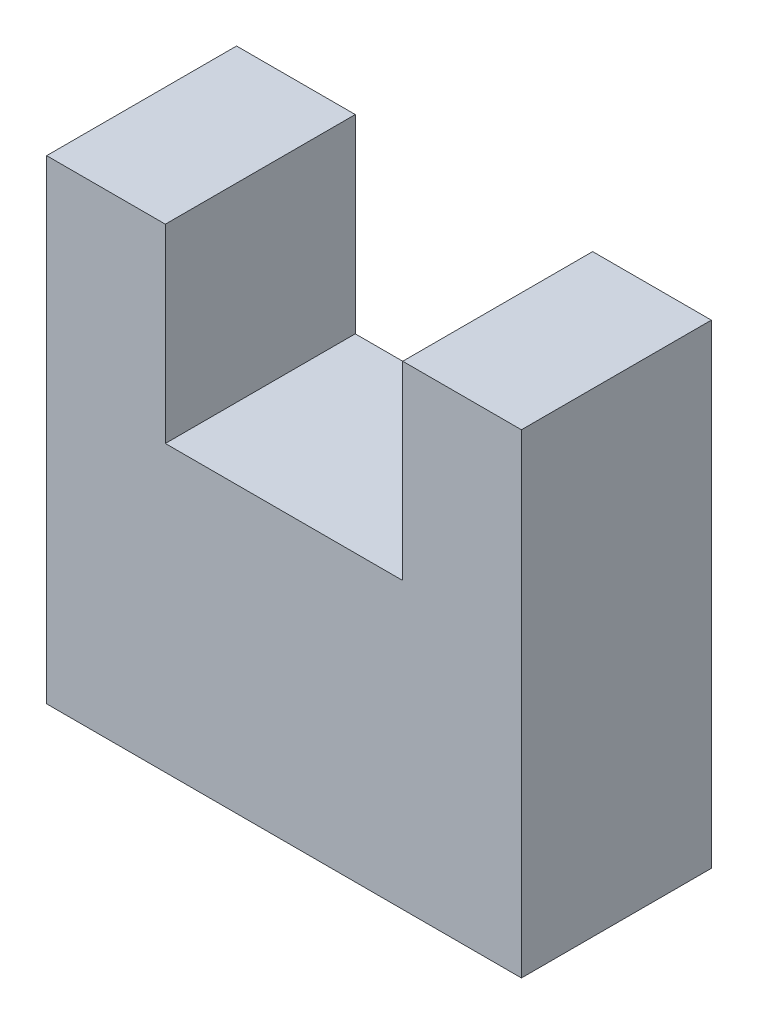
ISO-10303-21;
HEADER;
FILE_DESCRIPTION(('STEP AP214'),'2;1');
FILE_NAME('part.step','',(''),(''),'','','');
FILE_SCHEMA(('AUTOMOTIVE_DESIGN { 1 0 10303 214 1 1 1 1 }'));
ENDSEC;
DATA;
#1=APPLICATION_CONTEXT('core data for automotive mechanical design processes');
#2=APPLICATION_PROTOCOL_DEFINITION('international standard','automotive_design',2000,#1);
#3=PRODUCT_CONTEXT('',#1,'mechanical');
#4=PRODUCT('Part','Part','',(#3));
#5=PRODUCT_RELATED_PRODUCT_CATEGORY('part','',(#4));
#6=PRODUCT_DEFINITION_FORMATION('','',#4);
#7=PRODUCT_DEFINITION_CONTEXT('part definition',#1,'design');
#8=PRODUCT_DEFINITION('design','',#6,#7);
#9=PRODUCT_DEFINITION_SHAPE('','',#8);
#10=(LENGTH_UNIT() NAMED_UNIT(*) SI_UNIT(.MILLI.,.METRE.));
#11=(NAMED_UNIT(*) PLANE_ANGLE_UNIT() SI_UNIT($,.RADIAN.));
#12=(NAMED_UNIT(*) SI_UNIT($,.STERADIAN.) SOLID_ANGLE_UNIT());
#13=UNCERTAINTY_MEASURE_WITH_UNIT(LENGTH_MEASURE(1.E-05),#10,'distance_accuracy_value','');
#14=(GEOMETRIC_REPRESENTATION_CONTEXT(3) GLOBAL_UNCERTAINTY_ASSIGNED_CONTEXT((#13)) GLOBAL_UNIT_ASSIGNED_CONTEXT((#10,
#11,#12)) REPRESENTATION_CONTEXT('',''));
#15=CARTESIAN_POINT('',(0.,0.,0.));
#16=DIRECTION('',(0.,0.,1.));
#17=DIRECTION('',(1.,0.,0.));
#18=AXIS2_PLACEMENT_3D('',#15,#16,#17);
#19=CARTESIAN_POINT('',(-50.,0.,40.));
#20=DIRECTION('',(1.,0.,0.));
#21=DIRECTION('',(0.,0.,-1.));
#22=AXIS2_PLACEMENT_3D('',#19,#20,#21);
#23=PLANE('',#22);
#24=DIRECTION('',(0.,-1.,0.));
#25=VECTOR('',#24,1.);
#26=CARTESIAN_POINT('',(-50.,0.,0.));
#27=LINE('',#26,#25);
#28=CARTESIAN_POINT('',(-50.,100.,0.));
#29=VERTEX_POINT('',#28);
#30=CARTESIAN_POINT('',(-50.,0.,0.));
#31=VERTEX_POINT('',#30);
#32=EDGE_CURVE('E129',#29,#31,#27,.T.);
#33=ORIENTED_EDGE('',*,*,#32,.T.);
#34=DIRECTION('',(0.,0.,-1.));
#35=VECTOR('',#34,1.);
#36=CARTESIAN_POINT('',(-50.,0.,40.));
#37=LINE('',#36,#35);
#38=CARTESIAN_POINT('',(-50.,0.,40.));
#39=VERTEX_POINT('',#38);
#40=EDGE_CURVE('E11',#39,#31,#37,.T.);
#41=ORIENTED_EDGE('',*,*,#40,.F.);
#42=DIRECTION('',(0.,-1.,0.));
#43=VECTOR('',#42,1.);
#44=CARTESIAN_POINT('',(-50.,0.,40.));
#45=LINE('',#44,#43);
#46=CARTESIAN_POINT('',(-50.,100.,40.));
#47=VERTEX_POINT('',#46);
#48=EDGE_CURVE('E143',#47,#39,#45,.T.);
#49=ORIENTED_EDGE('',*,*,#48,.F.);
#50=DIRECTION('',(0.,0.,-1.));
#51=VECTOR('',#50,1.);
#52=CARTESIAN_POINT('',(-50.,100.,40.));
#53=LINE('',#52,#51);
#54=EDGE_CURVE('E125',#47,#29,#53,.T.);
#55=ORIENTED_EDGE('',*,*,#54,.T.);
#56=EDGE_LOOP('',(#33,#41,#49,#55));
#57=FACE_BOUND('',#56,.T.);
#58=ADVANCED_FACE('F33',(#57),#23,.F.);
#59=CARTESIAN_POINT('',(50.,0.,40.));
#60=DIRECTION('',(0.,1.,0.));
#61=DIRECTION('',(-1.,0.,0.));
#62=AXIS2_PLACEMENT_3D('',#59,#60,#61);
#63=PLANE('',#62);
#64=DIRECTION('',(1.,0.,0.));
#65=VECTOR('',#64,1.);
#66=CARTESIAN_POINT('',(50.,0.,0.));
#67=LINE('',#66,#65);
#68=CARTESIAN_POINT('',(50.,0.,0.));
#69=VERTEX_POINT('',#68);
#70=EDGE_CURVE('E132',#31,#69,#67,.T.);
#71=ORIENTED_EDGE('',*,*,#70,.T.);
#72=DIRECTION('',(0.,0.,-1.));
#73=VECTOR('',#72,1.);
#74=CARTESIAN_POINT('',(50.,0.,40.));
#75=LINE('',#74,#73);
#76=CARTESIAN_POINT('',(50.,0.,40.));
#77=VERTEX_POINT('',#76);
#78=EDGE_CURVE('E41',#77,#69,#75,.T.);
#79=ORIENTED_EDGE('',*,*,#78,.F.);
#80=DIRECTION('',(1.,0.,0.));
#81=VECTOR('',#80,1.);
#82=CARTESIAN_POINT('',(50.,0.,40.));
#83=LINE('',#82,#81);
#84=EDGE_CURVE('E92',#39,#77,#83,.T.);
#85=ORIENTED_EDGE('',*,*,#84,.F.);
#86=ORIENTED_EDGE('',*,*,#40,.T.);
#87=EDGE_LOOP('',(#71,#79,#85,#86));
#88=FACE_BOUND('',#87,.T.);
#89=ADVANCED_FACE('F178',(#88),#63,.F.);
#90=CARTESIAN_POINT('',(50.,0.,40.));
#91=DIRECTION('',(-1.,0.,0.));
#92=DIRECTION('',(0.,-1.,0.));
#93=AXIS2_PLACEMENT_3D('',#90,#91,#92);
#94=PLANE('',#93);
#95=DIRECTION('',(0.,1.,0.));
#96=VECTOR('',#95,1.);
#97=CARTESIAN_POINT('',(50.,0.,0.));
#98=LINE('',#97,#96);
#99=CARTESIAN_POINT('',(50.,100.,0.));
#100=VERTEX_POINT('',#99);
#101=EDGE_CURVE('E134',#69,#100,#98,.T.);
#102=ORIENTED_EDGE('',*,*,#101,.T.);
#103=DIRECTION('',(0.,0.,-1.));
#104=VECTOR('',#103,1.);
#105=CARTESIAN_POINT('',(50.,100.,40.));
#106=LINE('',#105,#104);
#107=CARTESIAN_POINT('',(50.,100.,40.));
#108=VERTEX_POINT('',#107);
#109=EDGE_CURVE('E150',#108,#100,#106,.T.);
#110=ORIENTED_EDGE('',*,*,#109,.F.);
#111=DIRECTION('',(0.,1.,0.));
#112=VECTOR('',#111,1.);
#113=CARTESIAN_POINT('',(50.,0.,40.));
#114=LINE('',#113,#112);
#115=EDGE_CURVE('E158',#77,#108,#114,.T.);
#116=ORIENTED_EDGE('',*,*,#115,.F.);
#117=ORIENTED_EDGE('',*,*,#78,.T.);
#118=EDGE_LOOP('',(#102,#110,#116,#117));
#119=FACE_BOUND('',#118,.T.);
#120=ADVANCED_FACE('F156',(#119),#94,.F.);
#121=CARTESIAN_POINT('',(50.,100.,40.));
#122=DIRECTION('',(0.,-1.,0.));
#123=DIRECTION('',(1.,0.,0.));
#124=AXIS2_PLACEMENT_3D('',#121,#122,#123);
#125=PLANE('',#124);
#126=DIRECTION('',(-1.,0.,0.));
#127=VECTOR('',#126,1.);
#128=CARTESIAN_POINT('',(50.,100.,0.));
#129=LINE('',#128,#127);
#130=CARTESIAN_POINT('',(25.,100.,0.));
#131=VERTEX_POINT('',#130);
#132=EDGE_CURVE('E136',#100,#131,#129,.T.);
#133=ORIENTED_EDGE('',*,*,#132,.T.);
#134=DIRECTION('',(0.,0.,-1.));
#135=VECTOR('',#134,1.);
#136=CARTESIAN_POINT('',(25.,100.,40.));
#137=LINE('',#136,#135);
#138=CARTESIAN_POINT('',(25.,100.,40.));
#139=VERTEX_POINT('',#138);
#140=EDGE_CURVE('E147',#139,#131,#137,.T.);
#141=ORIENTED_EDGE('',*,*,#140,.F.);
#142=DIRECTION('',(-1.,0.,0.));
#143=VECTOR('',#142,1.);
#144=CARTESIAN_POINT('',(50.,100.,40.));
#145=LINE('',#144,#143);
#146=EDGE_CURVE('E170',#108,#139,#145,.T.);
#147=ORIENTED_EDGE('',*,*,#146,.F.);
#148=ORIENTED_EDGE('',*,*,#109,.T.);
#149=EDGE_LOOP('',(#133,#141,#147,#148));
#150=FACE_BOUND('',#149,.T.);
#151=ADVANCED_FACE('F166',(#150),#125,.F.);
#152=CARTESIAN_POINT('',(25.,100.,40.));
#153=DIRECTION('',(1.,0.,0.));
#154=DIRECTION('',(0.,1.,0.));
#155=AXIS2_PLACEMENT_3D('',#152,#153,#154);
#156=PLANE('',#155);
#157=DIRECTION('',(0.,-1.,0.));
#158=VECTOR('',#157,1.);
#159=CARTESIAN_POINT('',(25.,100.,0.));
#160=LINE('',#159,#158);
#161=CARTESIAN_POINT('',(25.,60.,0.));
#162=VERTEX_POINT('',#161);
#163=EDGE_CURVE('E138',#131,#162,#160,.T.);
#164=ORIENTED_EDGE('',*,*,#163,.T.);
#165=DIRECTION('',(0.,0.,-1.));
#166=VECTOR('',#165,1.);
#167=CARTESIAN_POINT('',(25.,60.,40.));
#168=LINE('',#167,#166);
#169=CARTESIAN_POINT('',(25.,60.,40.));
#170=VERTEX_POINT('',#169);
#171=EDGE_CURVE('E120',#170,#162,#168,.T.);
#172=ORIENTED_EDGE('',*,*,#171,.F.);
#173=DIRECTION('',(0.,-1.,0.));
#174=VECTOR('',#173,1.);
#175=CARTESIAN_POINT('',(25.,100.,40.));
#176=LINE('',#175,#174);
#177=EDGE_CURVE('E111',#139,#170,#176,.T.);
#178=ORIENTED_EDGE('',*,*,#177,.F.);
#179=ORIENTED_EDGE('',*,*,#140,.T.);
#180=EDGE_LOOP('',(#164,#172,#178,#179));
#181=FACE_BOUND('',#180,.T.);
#182=ADVANCED_FACE('F169',(#181),#156,.F.);
#183=CARTESIAN_POINT('',(-25.,60.,40.));
#184=DIRECTION('',(0.,-1.,0.));
#185=DIRECTION('',(1.,0.,0.));
#186=AXIS2_PLACEMENT_3D('',#183,#184,#185);
#187=PLANE('',#186);
#188=DIRECTION('',(-1.,0.,0.));
#189=VECTOR('',#188,1.);
#190=CARTESIAN_POINT('',(-25.,60.,0.));
#191=LINE('',#190,#189);
#192=CARTESIAN_POINT('',(-25.,60.,0.));
#193=VERTEX_POINT('',#192);
#194=EDGE_CURVE('E119',#162,#193,#191,.T.);
#195=ORIENTED_EDGE('',*,*,#194,.T.);
#196=DIRECTION('',(0.,0.,-1.));
#197=VECTOR('',#196,1.);
#198=CARTESIAN_POINT('',(-25.,60.,40.));
#199=LINE('',#198,#197);
#200=CARTESIAN_POINT('',(-25.,60.,40.));
#201=VERTEX_POINT('',#200);
#202=EDGE_CURVE('E116',#201,#193,#199,.T.);
#203=ORIENTED_EDGE('',*,*,#202,.F.);
#204=DIRECTION('',(-1.,0.,0.));
#205=VECTOR('',#204,1.);
#206=CARTESIAN_POINT('',(-25.,60.,40.));
#207=LINE('',#206,#205);
#208=EDGE_CURVE('E105',#170,#201,#207,.T.);
#209=ORIENTED_EDGE('',*,*,#208,.F.);
#210=ORIENTED_EDGE('',*,*,#171,.T.);
#211=EDGE_LOOP('',(#195,#203,#209,#210));
#212=FACE_BOUND('',#211,.T.);
#213=ADVANCED_FACE('F117',(#212),#187,.F.);
#214=CARTESIAN_POINT('',(-25.,100.,40.));
#215=DIRECTION('',(-1.,0.,0.));
#216=DIRECTION('',(0.,-1.,0.));
#217=AXIS2_PLACEMENT_3D('',#214,#215,#216);
#218=PLANE('',#217);
#219=DIRECTION('',(0.,1.,0.));
#220=VECTOR('',#219,1.);
#221=CARTESIAN_POINT('',(-25.,100.,0.));
#222=LINE('',#221,#220);
#223=CARTESIAN_POINT('',(-25.,100.,0.));
#224=VERTEX_POINT('',#223);
#225=EDGE_CURVE('E78',#193,#224,#222,.T.);
#226=ORIENTED_EDGE('',*,*,#225,.T.);
#227=DIRECTION('',(0.,0.,-1.));
#228=VECTOR('',#227,1.);
#229=CARTESIAN_POINT('',(-25.,100.,40.));
#230=LINE('',#229,#228);
#231=CARTESIAN_POINT('',(-25.,100.,40.));
#232=VERTEX_POINT('',#231);
#233=EDGE_CURVE('E121',#232,#224,#230,.T.);
#234=ORIENTED_EDGE('',*,*,#233,.F.);
#235=DIRECTION('',(0.,1.,0.));
#236=VECTOR('',#235,1.);
#237=CARTESIAN_POINT('',(-25.,100.,40.));
#238=LINE('',#237,#236);
#239=EDGE_CURVE('E109',#201,#232,#238,.T.);
#240=ORIENTED_EDGE('',*,*,#239,.F.);
#241=ORIENTED_EDGE('',*,*,#202,.T.);
#242=EDGE_LOOP('',(#226,#234,#240,#241));
#243=FACE_BOUND('',#242,.T.);
#244=ADVANCED_FACE('F123',(#243),#218,.F.);
#245=CARTESIAN_POINT('',(-50.,100.,40.));
#246=DIRECTION('',(0.,-1.,0.));
#247=DIRECTION('',(0.,0.,-1.));
#248=AXIS2_PLACEMENT_3D('',#245,#246,#247);
#249=PLANE('',#248);
#250=DIRECTION('',(-1.,0.,0.));
#251=VECTOR('',#250,1.);
#252=CARTESIAN_POINT('',(-50.,100.,0.));
#253=LINE('',#252,#251);
#254=EDGE_CURVE('E84',#224,#29,#253,.T.);
#255=ORIENTED_EDGE('',*,*,#254,.T.);
#256=ORIENTED_EDGE('',*,*,#54,.F.);
#257=DIRECTION('',(-1.,0.,0.));
#258=VECTOR('',#257,1.);
#259=CARTESIAN_POINT('',(-50.,100.,40.));
#260=LINE('',#259,#258);
#261=EDGE_CURVE('E49',#232,#47,#260,.T.);
#262=ORIENTED_EDGE('',*,*,#261,.F.);
#263=ORIENTED_EDGE('',*,*,#233,.T.);
#264=EDGE_LOOP('',(#255,#256,#262,#263));
#265=FACE_BOUND('',#264,.T.);
#266=ADVANCED_FACE('F194',(#265),#249,.F.);
#267=CARTESIAN_POINT('',(0.,0.,40.));
#268=DIRECTION('',(0.,0.,-1.));
#269=DIRECTION('',(-1.,0.,0.));
#270=AXIS2_PLACEMENT_3D('',#267,#268,#269);
#271=PLANE('',#270);
#272=ORIENTED_EDGE('',*,*,#48,.T.);
#273=ORIENTED_EDGE('',*,*,#84,.T.);
#274=ORIENTED_EDGE('',*,*,#115,.T.);
#275=ORIENTED_EDGE('',*,*,#146,.T.);
#276=ORIENTED_EDGE('',*,*,#177,.T.);
#277=ORIENTED_EDGE('',*,*,#208,.T.);
#278=ORIENTED_EDGE('',*,*,#239,.T.);
#279=ORIENTED_EDGE('',*,*,#261,.T.);
#280=EDGE_LOOP('',(#272,#273,#274,#275,#276,#277,#278,#279));
#281=FACE_BOUND('',#280,.T.);
#282=ADVANCED_FACE('F107',(#281),#271,.F.);
#283=CARTESIAN_POINT('',(0.,0.,0.));
#284=DIRECTION('',(0.,0.,-1.));
#285=DIRECTION('',(-1.,0.,0.));
#286=AXIS2_PLACEMENT_3D('',#283,#284,#285);
#287=PLANE('',#286);
#288=ORIENTED_EDGE('',*,*,#32,.F.);
#289=ORIENTED_EDGE('',*,*,#254,.F.);
#290=ORIENTED_EDGE('',*,*,#225,.F.);
#291=ORIENTED_EDGE('',*,*,#194,.F.);
#292=ORIENTED_EDGE('',*,*,#163,.F.);
#293=ORIENTED_EDGE('',*,*,#132,.F.);
#294=ORIENTED_EDGE('',*,*,#101,.F.);
#295=ORIENTED_EDGE('',*,*,#70,.F.);
#296=EDGE_LOOP('',(#288,#289,#290,#291,#292,#293,#294,#295));
#297=FACE_BOUND('',#296,.T.);
#298=ADVANCED_FACE('F162',(#297),#287,.T.);
#299=CLOSED_SHELL('',(#58,#89,#120,#151,#182,#213,#244,#266,#282,#298));
#300=MANIFOLD_SOLID_BREP('B2',#299);
#301=ADVANCED_BREP_SHAPE_REPRESENTATION('',(#18,#300),#14);
#302=SHAPE_DEFINITION_REPRESENTATION(#9,#301);
ENDSEC;
END-ISO-10303-21;
